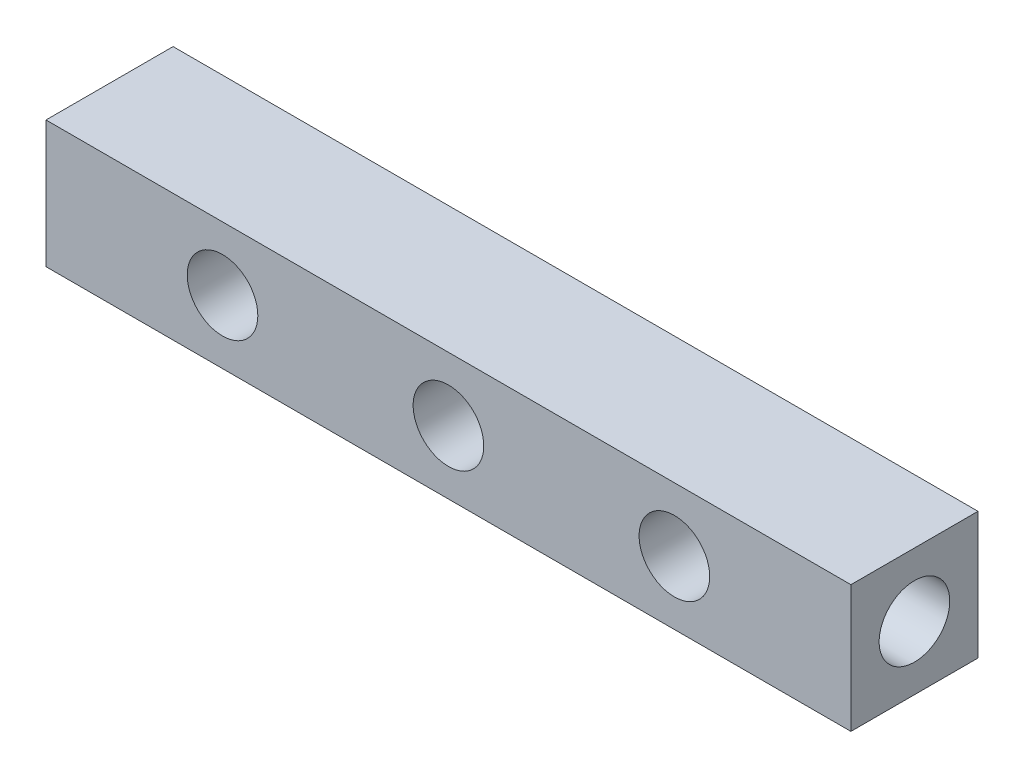
ISO-10303-21;
HEADER;
FILE_DESCRIPTION(('STEP AP214'),'2;1');
FILE_NAME('part.step','',(''),(''),'','','');
FILE_SCHEMA(('AUTOMOTIVE_DESIGN { 1 0 10303 214 1 1 1 1 }'));
ENDSEC;
DATA;
#1=APPLICATION_CONTEXT('core data for automotive mechanical design processes');
#2=APPLICATION_PROTOCOL_DEFINITION('international standard','automotive_design',2000,#1);
#3=PRODUCT_CONTEXT('',#1,'mechanical');
#4=PRODUCT('Part','Part','',(#3));
#5=PRODUCT_RELATED_PRODUCT_CATEGORY('part','',(#4));
#6=PRODUCT_DEFINITION_FORMATION('','',#4);
#7=PRODUCT_DEFINITION_CONTEXT('part definition',#1,'design');
#8=PRODUCT_DEFINITION('design','',#6,#7);
#9=PRODUCT_DEFINITION_SHAPE('','',#8);
#10=(LENGTH_UNIT() NAMED_UNIT(*) SI_UNIT(.MILLI.,.METRE.));
#11=(NAMED_UNIT(*) PLANE_ANGLE_UNIT() SI_UNIT($,.RADIAN.));
#12=(NAMED_UNIT(*) SI_UNIT($,.STERADIAN.) SOLID_ANGLE_UNIT());
#13=UNCERTAINTY_MEASURE_WITH_UNIT(LENGTH_MEASURE(1.E-05),#10,'distance_accuracy_value','');
#14=(GEOMETRIC_REPRESENTATION_CONTEXT(3) GLOBAL_UNCERTAINTY_ASSIGNED_CONTEXT((#13)) GLOBAL_UNIT_ASSIGNED_CONTEXT((#10,
#11,#12)) REPRESENTATION_CONTEXT('',''));
#15=CARTESIAN_POINT('',(0.,0.,0.));
#16=DIRECTION('',(0.,0.,1.));
#17=DIRECTION('',(1.,0.,0.));
#18=AXIS2_PLACEMENT_3D('',#15,#16,#17);
#19=CARTESIAN_POINT('',(-28.5000000000001,39.7499999999999,4.5));
#20=DIRECTION('',(1.,0.,0.));
#21=DIRECTION('',(0.,1.,0.));
#22=AXIS2_PLACEMENT_3D('',#19,#20,#21);
#23=PLANE('',#22);
#24=CARTESIAN_POINT('',(-28.5000000000003,37.4999999999999,2.25));
#25=DIRECTION('',(-1.,0.,0.));
#26=DIRECTION('',(0.,0.,1.));
#27=AXIS2_PLACEMENT_3D('',#24,#25,#26);
#28=CIRCLE('',#27,1.25);
#29=CARTESIAN_POINT('',(-28.5000000000003,37.4999999999999,3.5));
#30=VERTEX_POINT('',#29);
#31=EDGE_CURVE('E99',#30,#30,#28,.T.);
#32=ORIENTED_EDGE('',*,*,#31,.F.);
#33=EDGE_LOOP('',(#32));
#34=FACE_BOUND('',#33,.T.);
#35=DIRECTION('',(0.,-1.,0.));
#36=VECTOR('',#35,1.);
#37=CARTESIAN_POINT('',(-28.5000000000001,39.7499999999999,0.));
#38=LINE('',#37,#36);
#39=CARTESIAN_POINT('',(-28.5000000000001,39.7499999999999,0.));
#40=VERTEX_POINT('',#39);
#41=CARTESIAN_POINT('',(-28.5000000000002,35.2499999999999,0.));
#42=VERTEX_POINT('',#41);
#43=EDGE_CURVE('E111',#40,#42,#38,.T.);
#44=ORIENTED_EDGE('',*,*,#43,.T.);
#45=DIRECTION('',(0.,0.,-1.));
#46=VECTOR('',#45,1.);
#47=CARTESIAN_POINT('',(-28.5000000000002,35.2499999999999,4.5));
#48=LINE('',#47,#46);
#49=CARTESIAN_POINT('',(-28.5000000000002,35.2499999999999,4.5));
#50=VERTEX_POINT('',#49);
#51=EDGE_CURVE('E11',#50,#42,#48,.T.);
#52=ORIENTED_EDGE('',*,*,#51,.F.);
#53=DIRECTION('',(0.,-1.,0.));
#54=VECTOR('',#53,1.);
#55=CARTESIAN_POINT('',(-28.5000000000001,39.7499999999999,4.5));
#56=LINE('',#55,#54);
#57=CARTESIAN_POINT('',(-28.5000000000001,39.7499999999999,4.5));
#58=VERTEX_POINT('',#57);
#59=EDGE_CURVE('E112',#58,#50,#56,.T.);
#60=ORIENTED_EDGE('',*,*,#59,.F.);
#61=DIRECTION('',(0.,0.,-1.));
#62=VECTOR('',#61,1.);
#63=CARTESIAN_POINT('',(-28.5000000000001,39.7499999999999,4.5));
#64=LINE('',#63,#62);
#65=EDGE_CURVE('E54',#58,#40,#64,.T.);
#66=ORIENTED_EDGE('',*,*,#65,.T.);
#67=EDGE_LOOP('',(#44,#52,#60,#66));
#68=FACE_BOUND('',#67,.T.);
#69=ADVANCED_FACE('F38',(#34,#68),#23,.F.);
#70=CARTESIAN_POINT('',(-28.5000000000002,35.2499999999999,4.5));
#71=DIRECTION('',(0.,1.,0.));
#72=DIRECTION('',(0.,0.,1.));
#73=AXIS2_PLACEMENT_3D('',#70,#71,#72);
#74=PLANE('',#73);
#75=DIRECTION('',(1.,0.,0.));
#76=VECTOR('',#75,1.);
#77=CARTESIAN_POINT('',(-28.5000000000002,35.2499999999999,0.));
#78=LINE('',#77,#76);
#79=CARTESIAN_POINT('',(-1.04083408558608E-13,35.2499999999999,0.));
#80=VERTEX_POINT('',#79);
#81=EDGE_CURVE('E122',#42,#80,#78,.T.);
#82=ORIENTED_EDGE('',*,*,#81,.T.);
#83=DIRECTION('',(0.,0.,-1.));
#84=VECTOR('',#83,1.);
#85=CARTESIAN_POINT('',(-1.04083408558608E-13,35.2499999999999,4.5));
#86=LINE('',#85,#84);
#87=CARTESIAN_POINT('',(-1.04083408558608E-13,35.2499999999999,4.5));
#88=VERTEX_POINT('',#87);
#89=EDGE_CURVE('E46',#88,#80,#86,.T.);
#90=ORIENTED_EDGE('',*,*,#89,.F.);
#91=DIRECTION('',(1.,0.,0.));
#92=VECTOR('',#91,1.);
#93=CARTESIAN_POINT('',(-28.5000000000002,35.2499999999999,4.5));
#94=LINE('',#93,#92);
#95=EDGE_CURVE('E80',#50,#88,#94,.T.);
#96=ORIENTED_EDGE('',*,*,#95,.F.);
#97=ORIENTED_EDGE('',*,*,#51,.T.);
#98=EDGE_LOOP('',(#82,#90,#96,#97));
#99=FACE_BOUND('',#98,.T.);
#100=ADVANCED_FACE('F134',(#99),#74,.F.);
#101=CARTESIAN_POINT('',(0.,39.7499999999999,4.5));
#102=DIRECTION('',(1.,0.,0.));
#103=DIRECTION('',(0.,1.,0.));
#104=AXIS2_PLACEMENT_3D('',#101,#102,#103);
#105=PLANE('',#104);
#106=CARTESIAN_POINT('',(0.,37.4999999999999,2.25));
#107=DIRECTION('',(1.,0.,0.));
#108=DIRECTION('',(0.,0.,-1.));
#109=AXIS2_PLACEMENT_3D('',#106,#107,#108);
#110=CIRCLE('',#109,1.25);
#111=CARTESIAN_POINT('',(0.,37.4999999999999,0.999999999999998));
#112=VERTEX_POINT('',#111);
#113=EDGE_CURVE('E98',#112,#112,#110,.T.);
#114=ORIENTED_EDGE('',*,*,#113,.F.);
#115=EDGE_LOOP('',(#114));
#116=FACE_BOUND('',#115,.T.);
#117=DIRECTION('',(0.,-1.,0.));
#118=VECTOR('',#117,1.);
#119=CARTESIAN_POINT('',(0.,39.7499999999999,0.));
#120=LINE('',#119,#118);
#121=CARTESIAN_POINT('',(0.,39.7499999999999,0.));
#122=VERTEX_POINT('',#121);
#123=EDGE_CURVE('E125',#122,#80,#120,.T.);
#124=ORIENTED_EDGE('',*,*,#123,.F.);
#125=DIRECTION('',(0.,0.,-1.));
#126=VECTOR('',#125,1.);
#127=CARTESIAN_POINT('',(0.,39.7499999999999,4.5));
#128=LINE('',#127,#126);
#129=CARTESIAN_POINT('',(0.,39.7499999999999,4.5));
#130=VERTEX_POINT('',#129);
#131=EDGE_CURVE('E69',#130,#122,#128,.T.);
#132=ORIENTED_EDGE('',*,*,#131,.F.);
#133=DIRECTION('',(0.,-1.,0.));
#134=VECTOR('',#133,1.);
#135=CARTESIAN_POINT('',(0.,39.7499999999999,4.5));
#136=LINE('',#135,#134);
#137=EDGE_CURVE('E116',#130,#88,#136,.T.);
#138=ORIENTED_EDGE('',*,*,#137,.T.);
#139=ORIENTED_EDGE('',*,*,#89,.T.);
#140=EDGE_LOOP('',(#124,#132,#138,#139));
#141=FACE_BOUND('',#140,.T.);
#142=ADVANCED_FACE('F132',(#116,#141),#105,.T.);
#143=CARTESIAN_POINT('',(-28.5000000000001,39.7499999999999,4.5));
#144=DIRECTION('',(0.,1.,0.));
#145=DIRECTION('',(0.,0.,1.));
#146=AXIS2_PLACEMENT_3D('',#143,#144,#145);
#147=PLANE('',#146);
#148=DIRECTION('',(1.,0.,0.));
#149=VECTOR('',#148,1.);
#150=CARTESIAN_POINT('',(-28.5000000000001,39.7499999999999,0.));
#151=LINE('',#150,#149);
#152=EDGE_CURVE('E114',#40,#122,#151,.T.);
#153=ORIENTED_EDGE('',*,*,#152,.F.);
#154=ORIENTED_EDGE('',*,*,#65,.F.);
#155=DIRECTION('',(1.,0.,0.));
#156=VECTOR('',#155,1.);
#157=CARTESIAN_POINT('',(-28.5000000000001,39.7499999999999,4.5));
#158=LINE('',#157,#156);
#159=EDGE_CURVE('E119',#58,#130,#158,.T.);
#160=ORIENTED_EDGE('',*,*,#159,.T.);
#161=ORIENTED_EDGE('',*,*,#131,.T.);
#162=EDGE_LOOP('',(#153,#154,#160,#161));
#163=FACE_BOUND('',#162,.T.);
#164=ADVANCED_FACE('F138',(#163),#147,.T.);
#165=CARTESIAN_POINT('',(0.,0.,4.5));
#166=DIRECTION('',(0.,0.,1.));
#167=DIRECTION('',(1.,0.,0.));
#168=AXIS2_PLACEMENT_3D('',#165,#166,#167);
#169=PLANE('',#168);
#170=CARTESIAN_POINT('',(-14.2500000000001,37.4999999999999,4.5));
#171=DIRECTION('',(0.,0.,1.));
#172=DIRECTION('',(1.,0.,0.));
#173=AXIS2_PLACEMENT_3D('',#170,#171,#172);
#174=CIRCLE('',#173,1.24999999999999);
#175=CARTESIAN_POINT('',(-13.0000000000001,37.4999999999999,4.5));
#176=VERTEX_POINT('',#175);
#177=EDGE_CURVE('E200',#176,#176,#174,.T.);
#178=ORIENTED_EDGE('',*,*,#177,.F.);
#179=EDGE_LOOP('',(#178));
#180=FACE_BOUND('',#179,.T.);
#181=CARTESIAN_POINT('',(-22.2500000000001,37.4999999999999,4.5));
#182=DIRECTION('',(0.,0.,1.));
#183=DIRECTION('',(1.,0.,0.));
#184=AXIS2_PLACEMENT_3D('',#181,#182,#183);
#185=CIRCLE('',#184,1.24999999999999);
#186=CARTESIAN_POINT('',(-21.0000000000001,37.4999999999999,4.5));
#187=VERTEX_POINT('',#186);
#188=EDGE_CURVE('E196',#187,#187,#185,.T.);
#189=ORIENTED_EDGE('',*,*,#188,.F.);
#190=EDGE_LOOP('',(#189));
#191=FACE_BOUND('',#190,.T.);
#192=CARTESIAN_POINT('',(-6.25000000000013,37.4999999999999,4.5));
#193=DIRECTION('',(0.,0.,1.));
#194=DIRECTION('',(1.,0.,0.));
#195=AXIS2_PLACEMENT_3D('',#192,#193,#194);
#196=CIRCLE('',#195,1.24999999999999);
#197=CARTESIAN_POINT('',(-5.00000000000014,37.4999999999999,4.5));
#198=VERTEX_POINT('',#197);
#199=EDGE_CURVE('E191',#198,#198,#196,.T.);
#200=ORIENTED_EDGE('',*,*,#199,.F.);
#201=EDGE_LOOP('',(#200));
#202=FACE_BOUND('',#201,.T.);
#203=ORIENTED_EDGE('',*,*,#59,.T.);
#204=ORIENTED_EDGE('',*,*,#95,.T.);
#205=ORIENTED_EDGE('',*,*,#137,.F.);
#206=ORIENTED_EDGE('',*,*,#159,.F.);
#207=EDGE_LOOP('',(#203,#204,#205,#206));
#208=FACE_BOUND('',#207,.T.);
#209=ADVANCED_FACE('F140',(#180,#191,#202,#208),#169,.T.);
#210=CARTESIAN_POINT('',(0.,0.,0.));
#211=DIRECTION('',(0.,0.,1.));
#212=DIRECTION('',(1.,0.,0.));
#213=AXIS2_PLACEMENT_3D('',#210,#211,#212);
#214=PLANE('',#213);
#215=CARTESIAN_POINT('',(-14.2500000000001,37.4999999999999,0.));
#216=DIRECTION('',(0.,0.,1.));
#217=DIRECTION('',(1.,0.,0.));
#218=AXIS2_PLACEMENT_3D('',#215,#216,#217);
#219=CIRCLE('',#218,1.25);
#220=CARTESIAN_POINT('',(-13.0000000000001,37.4999999999999,0.));
#221=VERTEX_POINT('',#220);
#222=EDGE_CURVE('E184',#221,#221,#219,.T.);
#223=ORIENTED_EDGE('',*,*,#222,.T.);
#224=EDGE_LOOP('',(#223));
#225=FACE_BOUND('',#224,.T.);
#226=CARTESIAN_POINT('',(-22.2500000000001,37.4999999999999,0.));
#227=DIRECTION('',(0.,0.,1.));
#228=DIRECTION('',(1.,0.,0.));
#229=AXIS2_PLACEMENT_3D('',#226,#227,#228);
#230=CIRCLE('',#229,1.25);
#231=CARTESIAN_POINT('',(-21.0000000000001,37.4999999999999,0.));
#232=VERTEX_POINT('',#231);
#233=EDGE_CURVE('E188',#232,#232,#230,.T.);
#234=ORIENTED_EDGE('',*,*,#233,.T.);
#235=EDGE_LOOP('',(#234));
#236=FACE_BOUND('',#235,.T.);
#237=CARTESIAN_POINT('',(-6.25000000000013,37.4999999999999,0.));
#238=DIRECTION('',(0.,0.,1.));
#239=DIRECTION('',(1.,0.,0.));
#240=AXIS2_PLACEMENT_3D('',#237,#238,#239);
#241=CIRCLE('',#240,1.25);
#242=CARTESIAN_POINT('',(-5.00000000000013,37.4999999999999,0.));
#243=VERTEX_POINT('',#242);
#244=EDGE_CURVE('E105',#243,#243,#241,.T.);
#245=ORIENTED_EDGE('',*,*,#244,.T.);
#246=EDGE_LOOP('',(#245));
#247=FACE_BOUND('',#246,.T.);
#248=ORIENTED_EDGE('',*,*,#43,.F.);
#249=ORIENTED_EDGE('',*,*,#152,.T.);
#250=ORIENTED_EDGE('',*,*,#123,.T.);
#251=ORIENTED_EDGE('',*,*,#81,.F.);
#252=EDGE_LOOP('',(#248,#249,#250,#251));
#253=FACE_BOUND('',#252,.T.);
#254=ADVANCED_FACE('F137',(#225,#236,#247,#253),#214,.F.);
#255=CARTESIAN_POINT('',(-3.24892422621554,37.4999999999999,2.25));
#256=DIRECTION('',(1.,0.,0.));
#257=DIRECTION('',(0.,0.,-1.));
#258=AXIS2_PLACEMENT_3D('',#255,#256,#257);
#259=CONICAL_SURFACE('',#258,1.25,1.02974425867665);
#260=CARTESIAN_POINT('',(-3.99999999999999,37.4999999999999,2.25));
#261=VERTEX_POINT('',#260);
#262=VERTEX_LOOP('',#261);
#263=FACE_BOUND('',#262,.T.);
#264=CARTESIAN_POINT('',(-3.24892422621554,37.4999999999999,2.25));
#265=DIRECTION('',(1.,0.,0.));
#266=DIRECTION('',(0.,0.,-1.));
#267=AXIS2_PLACEMENT_3D('',#264,#265,#266);
#268=CIRCLE('',#267,1.25);
#269=CARTESIAN_POINT('',(-3.24892422621554,37.4999999999999,0.999999999999998));
#270=VERTEX_POINT('',#269);
#271=EDGE_CURVE('E102',#270,#270,#268,.T.);
#272=ORIENTED_EDGE('',*,*,#271,.T.);
#273=EDGE_LOOP('',(#272));
#274=FACE_BOUND('',#273,.T.);
#275=ADVANCED_FACE('F173',(#263,#274),#259,.F.);
#276=CARTESIAN_POINT('',(0.,37.4999999999999,2.25));
#277=DIRECTION('',(1.,0.,0.));
#278=DIRECTION('',(0.,0.,-1.));
#279=AXIS2_PLACEMENT_3D('',#276,#277,#278);
#280=CYLINDRICAL_SURFACE('',#279,1.25);
#281=ORIENTED_EDGE('',*,*,#271,.F.);
#282=EDGE_LOOP('',(#281));
#283=FACE_BOUND('',#282,.T.);
#284=ORIENTED_EDGE('',*,*,#113,.T.);
#285=EDGE_LOOP('',(#284));
#286=FACE_BOUND('',#285,.T.);
#287=ADVANCED_FACE('F92',(#283,#286),#280,.F.);
#288=CARTESIAN_POINT('',(-25.2510757737847,37.4999999999999,2.25));
#289=DIRECTION('',(-1.,0.,0.));
#290=DIRECTION('',(0.,0.,1.));
#291=AXIS2_PLACEMENT_3D('',#288,#289,#290);
#292=CONICAL_SURFACE('',#291,1.25,1.02974425867666);
#293=CARTESIAN_POINT('',(-24.5000000000003,37.4999999999999,2.25));
#294=VERTEX_POINT('',#293);
#295=VERTEX_LOOP('',#294);
#296=FACE_BOUND('',#295,.T.);
#297=CARTESIAN_POINT('',(-25.2510757737847,37.4999999999999,2.25));
#298=DIRECTION('',(-1.,0.,0.));
#299=DIRECTION('',(0.,0.,1.));
#300=AXIS2_PLACEMENT_3D('',#297,#298,#299);
#301=CIRCLE('',#300,1.25);
#302=CARTESIAN_POINT('',(-25.2510757737847,37.4999999999999,3.5));
#303=VERTEX_POINT('',#302);
#304=EDGE_CURVE('E96',#303,#303,#301,.T.);
#305=ORIENTED_EDGE('',*,*,#304,.T.);
#306=EDGE_LOOP('',(#305));
#307=FACE_BOUND('',#306,.T.);
#308=ADVANCED_FACE('F88',(#296,#307),#292,.F.);
#309=CARTESIAN_POINT('',(-28.5000000000003,37.4999999999999,2.25));
#310=DIRECTION('',(-1.,0.,0.));
#311=DIRECTION('',(0.,0.,1.));
#312=AXIS2_PLACEMENT_3D('',#309,#310,#311);
#313=CYLINDRICAL_SURFACE('',#312,1.25);
#314=ORIENTED_EDGE('',*,*,#304,.F.);
#315=EDGE_LOOP('',(#314));
#316=FACE_BOUND('',#315,.T.);
#317=ORIENTED_EDGE('',*,*,#31,.T.);
#318=EDGE_LOOP('',(#317));
#319=FACE_BOUND('',#318,.T.);
#320=ADVANCED_FACE('F91',(#316,#319),#313,.F.);
#321=CARTESIAN_POINT('',(-6.25000000000013,37.4999999999999,4.5));
#322=DIRECTION('',(0.,0.,1.));
#323=DIRECTION('',(1.,0.,0.));
#324=AXIS2_PLACEMENT_3D('',#321,#322,#323);
#325=CYLINDRICAL_SURFACE('',#324,1.24999999999999);
#326=ORIENTED_EDGE('',*,*,#244,.F.);
#327=EDGE_LOOP('',(#326));
#328=FACE_BOUND('',#327,.T.);
#329=ORIENTED_EDGE('',*,*,#199,.T.);
#330=EDGE_LOOP('',(#329));
#331=FACE_BOUND('',#330,.T.);
#332=ADVANCED_FACE('F161',(#328,#331),#325,.F.);
#333=CARTESIAN_POINT('',(-22.2500000000001,37.4999999999999,4.5));
#334=DIRECTION('',(0.,0.,1.));
#335=DIRECTION('',(1.,0.,0.));
#336=AXIS2_PLACEMENT_3D('',#333,#334,#335);
#337=CYLINDRICAL_SURFACE('',#336,1.24999999999999);
#338=ORIENTED_EDGE('',*,*,#233,.F.);
#339=EDGE_LOOP('',(#338));
#340=FACE_BOUND('',#339,.T.);
#341=ORIENTED_EDGE('',*,*,#188,.T.);
#342=EDGE_LOOP('',(#341));
#343=FACE_BOUND('',#342,.T.);
#344=ADVANCED_FACE('F166',(#340,#343),#337,.F.);
#345=CARTESIAN_POINT('',(-14.2500000000001,37.4999999999999,4.5));
#346=DIRECTION('',(0.,0.,1.));
#347=DIRECTION('',(1.,0.,0.));
#348=AXIS2_PLACEMENT_3D('',#345,#346,#347);
#349=CYLINDRICAL_SURFACE('',#348,1.24999999999999);
#350=ORIENTED_EDGE('',*,*,#222,.F.);
#351=EDGE_LOOP('',(#350));
#352=FACE_BOUND('',#351,.T.);
#353=ORIENTED_EDGE('',*,*,#177,.T.);
#354=EDGE_LOOP('',(#353));
#355=FACE_BOUND('',#354,.T.);
#356=ADVANCED_FACE('F204',(#352,#355),#349,.F.);
#357=CLOSED_SHELL('',(#69,#100,#142,#164,#209,#254,#275,#287,#308,#320,#332,#344,#356));
#358=MANIFOLD_SOLID_BREP('B2',#357);
#359=ADVANCED_BREP_SHAPE_REPRESENTATION('',(#18,#358),#14);
#360=SHAPE_DEFINITION_REPRESENTATION(#9,#359);
ENDSEC;
END-ISO-10303-21;
